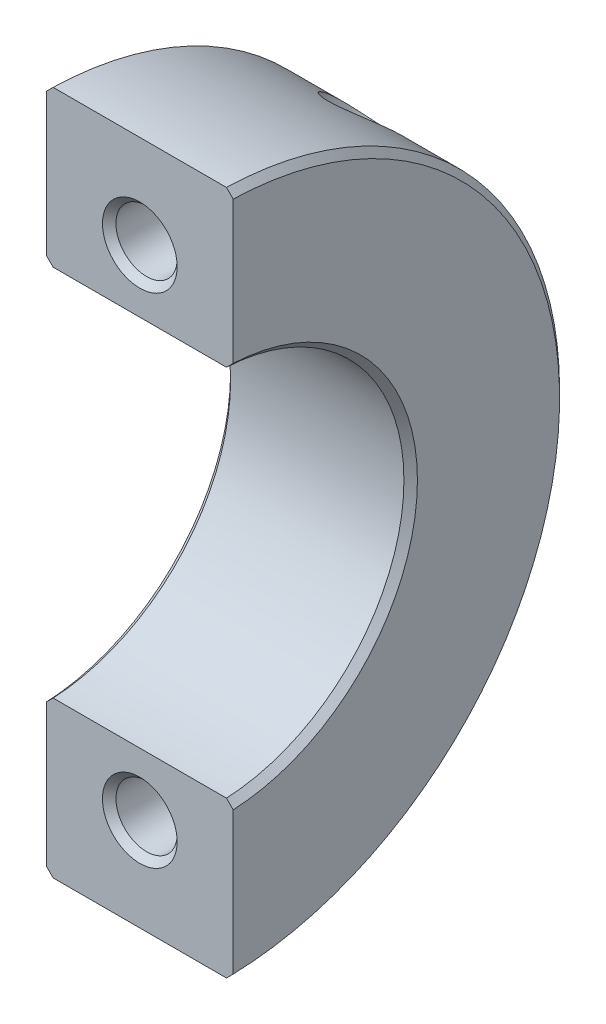
ISO-10303-21;
HEADER;
FILE_DESCRIPTION(('STEP AP214'),'2;1');
FILE_NAME('part.step','',(''),(''),'','','');
FILE_SCHEMA(('AUTOMOTIVE_DESIGN { 1 0 10303 214 1 1 1 1 }'));
ENDSEC;
DATA;
#1=APPLICATION_CONTEXT('core data for automotive mechanical design processes');
#2=APPLICATION_PROTOCOL_DEFINITION('international standard','automotive_design',2000,#1);
#3=PRODUCT_CONTEXT('',#1,'mechanical');
#4=PRODUCT('Part','Part','',(#3));
#5=PRODUCT_RELATED_PRODUCT_CATEGORY('part','',(#4));
#6=PRODUCT_DEFINITION_FORMATION('','',#4);
#7=PRODUCT_DEFINITION_CONTEXT('part definition',#1,'design');
#8=PRODUCT_DEFINITION('design','',#6,#7);
#9=PRODUCT_DEFINITION_SHAPE('','',#8);
#10=(LENGTH_UNIT() NAMED_UNIT(*) SI_UNIT(.MILLI.,.METRE.));
#11=(NAMED_UNIT(*) PLANE_ANGLE_UNIT() SI_UNIT($,.RADIAN.));
#12=(NAMED_UNIT(*) SI_UNIT($,.STERADIAN.) SOLID_ANGLE_UNIT());
#13=UNCERTAINTY_MEASURE_WITH_UNIT(LENGTH_MEASURE(1.E-05),#10,'distance_accuracy_value','');
#14=(GEOMETRIC_REPRESENTATION_CONTEXT(3) GLOBAL_UNCERTAINTY_ASSIGNED_CONTEXT((#13)) GLOBAL_UNIT_ASSIGNED_CONTEXT((#10,
#11,#12)) REPRESENTATION_CONTEXT('',''));
#15=CARTESIAN_POINT('',(0.,0.,0.));
#16=DIRECTION('',(0.,0.,1.));
#17=DIRECTION('',(1.,0.,0.));
#18=AXIS2_PLACEMENT_3D('',#15,#16,#17);
#19=CARTESIAN_POINT('',(-7.5,27.4897708247995,-0.75));
#20=DIRECTION('',(0.,0.,1.));
#21=DIRECTION('',(1.,0.,0.));
#22=AXIS2_PLACEMENT_3D('',#19,#20,#21);
#23=PLANE('',#22);
#24=CARTESIAN_POINT('',(0.,20.,-0.75));
#25=DIRECTION('',(0.,0.,1.));
#26=DIRECTION('',(1.,0.,0.));
#27=AXIS2_PLACEMENT_3D('',#24,#25,#26);
#28=CIRCLE('',#27,2.99999999993467);
#29=CARTESIAN_POINT('',(2.99999999993467,20.,-0.75));
#30=VERTEX_POINT('',#29);
#31=EDGE_CURVE('E280',#30,#30,#28,.F.);
#32=ORIENTED_EDGE('',*,*,#31,.T.);
#33=EDGE_LOOP('',(#32));
#34=FACE_BOUND('',#33,.T.);
#35=DIRECTION('',(-1.,0.,0.));
#36=VECTOR('',#35,1.);
#37=CARTESIAN_POINT('',(7.5,14.9812382665786,-0.75));
#38=LINE('',#37,#36);
#39=CARTESIAN_POINT('',(6.95850000006539,14.9812382665786,-0.75));
#40=VERTEX_POINT('',#39);
#41=CARTESIAN_POINT('',(-6.9585000000653,14.9812382665786,-0.75));
#42=VERTEX_POINT('',#41);
#43=EDGE_CURVE('E133',#40,#42,#38,.T.);
#44=ORIENTED_EDGE('',*,*,#43,.F.);
#45=CARTESIAN_POINT('',(6.95850000006539,14.9812382665786,-0.75));
#46=CARTESIAN_POINT('',(7.04874806257381,15.0715992810951,-0.75));
#47=CARTESIAN_POINT('',(7.13899709382266,15.1619593280405,-0.75));
#48=CARTESIAN_POINT('',(7.31949709380087,15.342677486789,-0.75));
#49=CARTESIAN_POINT('',(7.40974806253022,15.4330355985921,-0.75));
#50=CARTESIAN_POINT('',(7.5,15.5233927428242,-0.75));
#51=B_SPLINE_CURVE_WITH_KNOTS('',3,(#45,#46,#47,#48,#49,#50),.UNSPECIFIED.,.F.,.F.,(4,2,4),(0.,
0.383129784182915,0.766259568364265),.UNSPECIFIED.);
#52=CARTESIAN_POINT('',(7.5,15.5233927428242,-0.75));
#53=VERTEX_POINT('',#52);
#54=EDGE_CURVE('E234',#40,#53,#51,.T.);
#55=ORIENTED_EDGE('',*,*,#54,.T.);
#56=DIRECTION('',(0.,-1.,0.));
#57=VECTOR('',#56,1.);
#58=CARTESIAN_POINT('',(7.5,27.4897708247995,-0.75));
#59=LINE('',#58,#57);
#60=CARTESIAN_POINT('',(7.5,26.9480652784857,-0.75));
#61=VERTEX_POINT('',#60);
#62=EDGE_CURVE('E125',#61,#53,#59,.T.);
#63=ORIENTED_EDGE('',*,*,#62,.F.);
#64=CARTESIAN_POINT('',(7.5,26.9480652784857,-0.75));
#65=CARTESIAN_POINT('',(7.40975034084149,27.0383498769059,-0.75));
#66=CARTESIAN_POINT('',(7.31950051126768,27.1286343049755,-0.75));
#67=CARTESIAN_POINT('',(7.13900051128947,27.3092028204135,-0.75));
#68=CARTESIAN_POINT('',(7.04875034088507,27.3994869077818,-0.75));
#69=CARTESIAN_POINT('',(6.95850000006538,27.4897708247995,-0.75));
#70=B_SPLINE_CURVE_WITH_KNOTS('',3,(#64,#65,#66,#67,#68,#69),.UNSPECIFIED.,.F.,.F.,(4,2,4),(0.,
0.382971000481282,0.765942000962532),.UNSPECIFIED.);
#71=CARTESIAN_POINT('',(6.95850000006537,27.4897708247995,-0.75));
#72=VERTEX_POINT('',#71);
#73=EDGE_CURVE('E223',#61,#72,#70,.T.);
#74=ORIENTED_EDGE('',*,*,#73,.T.);
#75=DIRECTION('',(1.,0.,0.));
#76=VECTOR('',#75,1.);
#77=CARTESIAN_POINT('',(-7.5,27.4897708247995,-0.75));
#78=LINE('',#77,#76);
#79=CARTESIAN_POINT('',(-6.95850000006534,27.4897708247995,-0.75));
#80=VERTEX_POINT('',#79);
#81=EDGE_CURVE('E145',#80,#72,#78,.T.);
#82=ORIENTED_EDGE('',*,*,#81,.F.);
#83=CARTESIAN_POINT('',(-6.95850000006534,27.4897708247995,-0.75));
#84=CARTESIAN_POINT('',(-7.04875034088504,27.3994869077818,-0.75));
#85=CARTESIAN_POINT('',(-7.13900051128945,27.3092028204135,-0.75));
#86=CARTESIAN_POINT('',(-7.31950051126767,27.1286343049755,-0.75));
#87=CARTESIAN_POINT('',(-7.40975034084148,27.0383498769059,-0.75));
#88=CARTESIAN_POINT('',(-7.5,26.9480652784856,-0.75));
#89=B_SPLINE_CURVE_WITH_KNOTS('',3,(#83,#84,#85,#86,#87,#88),.UNSPECIFIED.,.F.,.F.,(4,2,4),(0.,
0.382971000481283,0.765942000962598),.UNSPECIFIED.);
#90=CARTESIAN_POINT('',(-7.5,26.9480652784856,-0.75));
#91=VERTEX_POINT('',#90);
#92=EDGE_CURVE('E60',#80,#91,#89,.T.);
#93=ORIENTED_EDGE('',*,*,#92,.T.);
#94=DIRECTION('',(0.,-1.,0.));
#95=VECTOR('',#94,1.);
#96=CARTESIAN_POINT('',(-7.5,27.4897708247995,-0.75));
#97=LINE('',#96,#95);
#98=CARTESIAN_POINT('',(-7.5,15.5233927428243,-0.75));
#99=VERTEX_POINT('',#98);
#100=EDGE_CURVE('E141',#91,#99,#97,.T.);
#101=ORIENTED_EDGE('',*,*,#100,.T.);
#102=CARTESIAN_POINT('',(-7.5,15.5233927428243,-0.75));
#103=CARTESIAN_POINT('',(-7.4097480625302,15.4330355985922,-0.75));
#104=CARTESIAN_POINT('',(-7.31949709380084,15.3426774867891,-0.75));
#105=CARTESIAN_POINT('',(-7.13899709382261,15.1619593280405,-0.75));
#106=CARTESIAN_POINT('',(-7.04874806257374,15.0715992810951,-0.75));
#107=CARTESIAN_POINT('',(-6.95850000006531,14.9812382665786,-0.75));
#108=B_SPLINE_CURVE_WITH_KNOTS('',3,(#102,#103,#104,#105,#106,#107),.UNSPECIFIED.,.F.,.F.,(4,2,
4),(0.,0.383129784181416,0.766259568364395),.UNSPECIFIED.);
#109=EDGE_CURVE('E229',#99,#42,#108,.T.);
#110=ORIENTED_EDGE('',*,*,#109,.T.);
#111=EDGE_LOOP('',(#44,#55,#63,#74,#82,#93,#101,#110));
#112=FACE_BOUND('',#111,.T.);
#113=ADVANCED_FACE('F37',(#34,#112),#23,.T.);
#114=CARTESIAN_POINT('',(-7.5,0.,0.));
#115=DIRECTION('',(1.,0.,0.));
#116=DIRECTION('',(0.,0.,-1.));
#117=AXIS2_PLACEMENT_3D('',#114,#115,#116);
#118=CYLINDRICAL_SURFACE('',#117,27.5);
#119=CARTESIAN_POINT('',(2.45850000000001,-20.,-18.8745860881769));
#120=CARTESIAN_POINT('',(2.45849990353132,-20.1028473085006,-18.7656070962104));
#121=CARTESIAN_POINT('',(2.45205660136979,-20.2047864967451,-18.6558007197101));
#122=CARTESIAN_POINT('',(2.42683352506415,-20.4062127973291,-18.4352593397697));
#123=CARTESIAN_POINT('',(2.40804748233893,-20.5056986370199,-18.3245238927044));
#124=CARTESIAN_POINT('',(2.35839998531785,-20.7017232367494,-18.1027788157753));
#125=CARTESIAN_POINT('',(2.32751594671807,-20.798256118783,-17.9917690612282));
#126=CARTESIAN_POINT('',(2.25372560210437,-20.9875531857472,-17.7705874156801));
#127=CARTESIAN_POINT('',(2.21082427894673,-21.0803189144783,-17.6604151968088));
#128=CARTESIAN_POINT('',(2.12572947491026,-21.2374253079542,-17.4709088219299));
#129=CARTESIAN_POINT('',(2.0863621513782,-21.3027832090554,-17.3911406618269));
#130=CARTESIAN_POINT('',(2.00074605912717,-21.430792375411,-17.2331502012469));
#131=CARTESIAN_POINT('',(1.95449878753136,-21.4934442257025,-17.1549275686374));
#132=CARTESIAN_POINT('',(1.85486628290582,-21.6155148899159,-17.00085735911));
#133=CARTESIAN_POINT('',(1.80149703964181,-21.6749405384192,-16.9250049184081));
#134=CARTESIAN_POINT('',(1.68707480818979,-21.7901360073354,-16.7764360133313));
#135=CARTESIAN_POINT('',(1.62602583383806,-21.8459077145018,-16.7037179372354));
#136=CARTESIAN_POINT('',(1.48222085932619,-21.9640786409367,-16.5481303560658));
#137=CARTESIAN_POINT('',(1.39757961859874,-22.0254970285639,-16.466230537263));
#138=CARTESIAN_POINT('',(1.21495130899149,-22.1400246914178,-16.3119129621685));
#139=CARTESIAN_POINT('',(1.11697958578317,-22.1931433721422,-16.2394844880513));
#140=CARTESIAN_POINT('',(0.932372676282858,-22.2765135458774,-16.1248474034656));
#141=CARTESIAN_POINT('',(0.848763808545262,-22.3091854879332,-16.0795716418497));
#142=CARTESIAN_POINT('',(0.673716040498875,-22.3661694961881,-16.0002141588967));
#143=CARTESIAN_POINT('',(0.582290132173302,-22.3904951091965,-15.9661143021744));
#144=CARTESIAN_POINT('',(0.409722770569238,-22.4254247493858,-15.9170059338798));
#145=CARTESIAN_POINT('',(0.32957889679,-22.4376844677686,-15.8997015893727));
#146=CARTESIAN_POINT('',(0.166859112927502,-22.4541902575735,-15.8763835032391));
#147=CARTESIAN_POINT('',(0.0842850752854429,-22.4584423427754,-15.870361288684));
#148=CARTESIAN_POINT('',(-0.0809858135138199,-22.4585565513222,-15.8701996759227));
#149=CARTESIAN_POINT('',(-0.163682688167048,-22.4544080813743,-15.8760752811402));
#150=CARTESIAN_POINT('',(-0.326667547666631,-22.4380806179644,-15.8991423977663));
#151=CARTESIAN_POINT('',(-0.406953684148092,-22.4258956192123,-15.916342371284));
#152=CARTESIAN_POINT('',(-0.582086480635042,-22.3906441964351,-15.9659065434751));
#153=CARTESIAN_POINT('',(-0.675788465351909,-22.3656650076208,-16.0009236635697));
#154=CARTESIAN_POINT('',(-0.854981333189616,-22.3069823126791,-16.0826325826107));
#155=CARTESIAN_POINT('',(-0.940456560202937,-22.2732626059613,-16.1293460552673));
#156=CARTESIAN_POINT('',(-1.14248897313866,-22.1809641066205,-16.2561849634975));
#157=CARTESIAN_POINT('',(-1.25387645836865,-22.1182815031823,-16.3414950232853));
#158=CARTESIAN_POINT('',(-1.4592758798392,-21.9824127796686,-16.523817452469));
#159=CARTESIAN_POINT('',(-1.55324474941753,-21.9092014001214,-16.6208578721118));
#160=CARTESIAN_POINT('',(-1.70793931433483,-21.7707630615361,-16.8016099282702));
#161=CARTESIAN_POINT('',(-1.77153532366999,-21.7069569816572,-16.883998678772));
#162=CARTESIAN_POINT('',(-1.88963359642018,-21.5752269176095,-17.05200811214));
#163=CARTESIAN_POINT('',(-1.94413061397557,-21.5073005885377,-17.1376306247345));
#164=CARTESIAN_POINT('',(-2.04459968043805,-21.3679245571619,-17.3111003929168));
#165=CARTESIAN_POINT('',(-2.09056417740289,-21.2964718038247,-17.3989495418409));
#166=CARTESIAN_POINT('',(-2.17427537068142,-21.150573890446,-17.5760173891968));
#167=CARTESIAN_POINT('',(-2.21202353614821,-21.0761292682019,-17.6652358397259));
#168=CARTESIAN_POINT('',(-2.28111226995138,-20.921027422208,-17.8486890274963));
#169=CARTESIAN_POINT('',(-2.31206650110297,-20.8402427981969,-17.9429618367341));
#170=CARTESIAN_POINT('',(-2.36526201567847,-20.6761631323197,-18.1317944152689));
#171=CARTESIAN_POINT('',(-2.38750038275921,-20.5928672602083,-18.2263542699647));
#172=CARTESIAN_POINT('',(-2.4409940766594,-20.339853442136,-18.509569676917));
#173=CARTESIAN_POINT('',(-2.45910807939005,-20.1668284061082,-18.6979754978234));
#174=CARTESIAN_POINT('',(-2.45788493716535,-19.8224731769478,-19.0625309532353));
#175=CARTESIAN_POINT('',(-2.4399796551361,-19.651339669668,-19.2388720934584));
#176=CARTESIAN_POINT('',(-2.36574048621276,-19.3084954004601,-19.5829162746263));
#177=CARTESIAN_POINT('',(-2.30945098475115,-19.1367855329637,-19.750629052306));
#178=CARTESIAN_POINT('',(-2.17480430551793,-18.8455678341072,-20.0280674266222));
#179=CARTESIAN_POINT('',(-2.10661594356735,-18.7245663064784,-20.141156284448));
#180=CARTESIAN_POINT('',(-1.94527157335692,-18.4899181763153,-20.3567713799904));
#181=CARTESIAN_POINT('',(-1.8521504182697,-18.3762615796474,-20.4593120879297));
#182=CARTESIAN_POINT('',(-1.66271698846492,-18.185182718517,-20.6291498931657));
#183=CARTESIAN_POINT('',(-1.57148126295003,-18.1052493075079,-20.69926650688));
#184=CARTESIAN_POINT('',(-1.37298128064481,-17.9568541170779,-20.8281304337483));
#185=CARTESIAN_POINT('',(-1.26573537361238,-17.8883793926218,-20.8868905882417));
#186=CARTESIAN_POINT('',(-1.05522949905044,-17.7768249411045,-20.9818728766762));
#187=CARTESIAN_POINT('',(-0.954157857955895,-17.7314262739956,-21.0202062571219));
#188=CARTESIAN_POINT('',(-0.743496282775712,-17.6539383731537,-21.0853274503553));
#189=CARTESIAN_POINT('',(-0.633910197018848,-17.6218431676452,-21.1121204437059));
#190=CARTESIAN_POINT('',(-0.40845736024515,-17.5729139553767,-21.1528659077745));
#191=CARTESIAN_POINT('',(-0.292562934914608,-17.5561540966719,-21.1667559964239));
#192=CARTESIAN_POINT('',(-0.0587449347170487,-17.5394120125801,-21.1806316380468));
#193=CARTESIAN_POINT('',(0.0591780458441868,-17.5394249542408,-21.1806211963502));
#194=CARTESIAN_POINT('',(0.283119756180512,-17.5554945745109,-21.1673023421418));
#195=CARTESIAN_POINT('',(0.389307092763932,-17.5702049394297,-21.1551098297485));
#196=CARTESIAN_POINT('',(0.597077822560281,-17.6127488910621,-21.1197025270019));
#197=CARTESIAN_POINT('',(0.698661206416872,-17.6405825044441,-21.0964877142498));
#198=CARTESIAN_POINT('',(0.897448835913888,-17.7086832472033,-21.0393570156364));
#199=CARTESIAN_POINT('',(0.994474832902504,-17.7492499380376,-21.0051828245404));
#200=CARTESIAN_POINT('',(1.1796587894884,-17.8405310184917,-20.9277098907923));
#201=CARTESIAN_POINT('',(1.26781249667164,-17.8912502396541,-20.8844068032167));
#202=CARTESIAN_POINT('',(1.46729077659321,-18.0224751878166,-20.7713863037255));
#203=CARTESIAN_POINT('',(1.57401103037066,-18.1068325364389,-20.6979920389709));
#204=CARTESIAN_POINT('',(1.76787530401491,-18.2864119944944,-20.5395121629318));
#205=CARTESIAN_POINT('',(1.85497873868291,-18.3816560250281,-20.4544028897375));
#206=CARTESIAN_POINT('',(2.03581028533496,-18.6116233473655,-20.2457094160712));
#207=CARTESIAN_POINT('',(2.12220934568822,-18.7489890804573,-20.118707217693));
#208=CARTESIAN_POINT('',(2.26408210099224,-19.0289991277318,-19.8540786133856));
#209=CARTESIAN_POINT('',(2.31953875947846,-19.1716463038087,-19.7164464020947));
#210=CARTESIAN_POINT('',(2.39433859251578,-19.4293790645306,-19.46214963426));
#211=CARTESIAN_POINT('',(2.41866330015347,-19.5443188699962,-19.346741539999));
#212=CARTESIAN_POINT('',(2.45074253979342,-19.7732034594356,-19.112749328735));
#213=CARTESIAN_POINT('',(2.45850010585251,-19.8871484217946,-18.9941657973006));
#214=CARTESIAN_POINT('',(2.45850000000001,-20.,-18.8745860881769));
#215=B_SPLINE_CURVE_WITH_KNOTS('',3,(#119,#120,#121,#122,#123,#124,#125,#126,#127,#128,#129,
#130,#131,#132,#133,#134,#135,#136,#137,#138,#139,#140,#141,#142,#143,#144,#145,#146,#147,#148,
#149,#150,#151,#152,#153,#154,#155,#156,#157,#158,#159,#160,#161,#162,#163,#164,#165,#166,#167,
#168,#169,#170,#171,#172,#173,#174,#175,#176,#177,#178,#179,#180,#181,#182,#183,#184,#185,#186,
#187,#188,#189,#190,#191,#192,#193,#194,#195,#196,#197,#198,#199,#200,#201,#202,#203,#204,#205,
#206,#207,#208,#209,#210,#211,#212,#213,#214),.UNSPECIFIED.,.T.,.F.,(4,2,2,2,2,2,2,2,2,2,2,2,2,
2,2,2,2,2,2,2,2,2,2,2,2,2,2,2,2,2,2,2,2,2,2,2,2,2,2,2,2,2,2,2,2,2,2,4),(0.,0.44937381048829,
0.898976023731246,1.34942157638547,1.79968063171323,2.13060080225893,2.4614490673901,
2.79156665376201,3.12151241443172,3.51900890832684,3.91605162711458,4.21665714253409,
4.51677241535759,4.76440290494857,5.01184734829931,5.25960401908409,5.50754603593245,
5.81514603786734,6.12332030618504,6.58177925391551,7.04135702482384,7.40711930179255,
7.77309172964731,8.13938654297499,8.50561580563099,8.88912380650695,9.27276002049176,
10.0391648040731,10.7757049043222,11.5113947505346,12.0469506342239,12.5817617461589,
13.0005299570238,13.4188218383139,13.7690860364923,14.1191928342625,14.4709836261996,
14.822673052376,15.1448523809391,15.4670323642186,15.7974456546367,16.1280165626657,
16.5891816767045,17.0512923042876,17.6661683782601,18.2813826613844,18.7745587522247,
19.2676445165208),.UNSPECIFIED.);
#216=CARTESIAN_POINT('',(2.45850000000001,-20.,-18.8745860881769));
#217=VERTEX_POINT('',#216);
#218=EDGE_CURVE('E156',#217,#217,#215,.T.);
#219=ORIENTED_EDGE('',*,*,#218,.F.);
#220=EDGE_LOOP('',(#219));
#221=FACE_BOUND('',#220,.T.);
#222=CARTESIAN_POINT('',(2.45850000000001,20.,-18.8745860881769));
#223=CARTESIAN_POINT('',(2.45849903685019,19.9101006922754,-18.9698448801011));
#224=CARTESIAN_POINT('',(2.45357126295832,19.8195082789246,-19.0644708455221));
#225=CARTESIAN_POINT('',(2.43336040850576,19.6375480339031,-19.2518534458948));
#226=CARTESIAN_POINT('',(2.41807303516138,19.5461798962945,-19.3446092894961));
#227=CARTESIAN_POINT('',(2.35568822660431,19.2719385893018,-19.6190885219108));
#228=CARTESIAN_POINT('',(2.29207160189933,19.0886792727254,-19.7972874102591));
#229=CARTESIAN_POINT('',(2.14497419387902,18.7913925792562,-20.0788558074421));
#230=CARTESIAN_POINT('',(2.07553498470458,18.6749530704127,-20.1871160623274));
#231=CARTESIAN_POINT('',(1.91302740268866,18.449588831665,-20.39327808539));
#232=CARTESIAN_POINT('',(1.81999872034657,18.3406518660264,-20.4911968654528));
#233=CARTESIAN_POINT('',(1.63026638611544,18.1560046822503,-20.6548207043497));
#234=CARTESIAN_POINT('',(1.53799229821059,18.0779999029401,-20.7230562415749));
#235=CARTESIAN_POINT('',(1.33778868436917,17.9336705168636,-20.8480827088889));
#236=CARTESIAN_POINT('',(1.22987540426258,17.8673339456743,-20.904885370822));
#237=CARTESIAN_POINT('',(1.01844336840866,17.7597515283284,-20.9963189155455));
#238=CARTESIAN_POINT('',(0.917018836872623,17.7161850316685,-21.0330476497061));
#239=CARTESIAN_POINT('',(0.706058838015553,17.6424242410448,-21.0949566978063));
#240=CARTESIAN_POINT('',(0.596527211687081,17.6122236612946,-21.1201424404368));
#241=CARTESIAN_POINT('',(0.371672106583352,17.5670420292585,-21.1577390779018));
#242=CARTESIAN_POINT('',(0.256324765164128,17.5521301322511,-21.1700919290419));
#243=CARTESIAN_POINT('',(0.0240332834442365,17.5388691170811,-21.1810800934512));
#244=CARTESIAN_POINT('',(-0.0929104746634521,17.5405161017214,-21.1797186344365));
#245=CARTESIAN_POINT('',(-0.3153140157591,17.5594511076944,-21.164021238903));
#246=CARTESIAN_POINT('',(-0.420956313747384,17.5755050118056,-21.1507089923366));
#247=CARTESIAN_POINT('',(-0.627397170821221,17.6205545252133,-21.1131927809313));
#248=CARTESIAN_POINT('',(-0.728195660038349,17.6495503211252,-21.0889886590371));
#249=CARTESIAN_POINT('',(-0.9258564614326,17.720005665564,-21.0298255476063));
#250=CARTESIAN_POINT('',(-1.0224904279818,17.7618335143142,-20.9945479233707));
#251=CARTESIAN_POINT('',(-1.20669657001686,17.8555172469202,-20.9149298204712));
#252=CARTESIAN_POINT('',(-1.29426392622965,17.9073784223144,-20.8705845588641));
#253=CARTESIAN_POINT('',(-1.49295560133528,18.0417063875032,-20.754697963718));
#254=CARTESIAN_POINT('',(-1.59927771468659,18.1280668405694,-20.6794121901448));
#255=CARTESIAN_POINT('',(-1.79190492255418,18.3114880199797,-20.5171755555197));
#256=CARTESIAN_POINT('',(-1.87817166689438,18.4085687315669,-20.4302028393513));
#257=CARTESIAN_POINT('',(-2.05683343965443,18.6428075102148,-20.217028986525));
#258=CARTESIAN_POINT('',(-2.14172713979814,18.7825576277662,-20.0874003785006));
#259=CARTESIAN_POINT('',(-2.28012256490158,19.0670623185141,-19.8175651109282));
#260=CARTESIAN_POINT('',(-2.33358161619821,19.2118234134819,-19.6773443620498));
#261=CARTESIAN_POINT('',(-2.42499414915662,19.5491341392264,-19.3430652754481));
#262=CARTESIAN_POINT('',(-2.45228128719907,19.7419426797389,-19.1463060189451));
#263=CARTESIAN_POINT('',(-2.46019238311569,20.0268087792558,-18.8466507371827));
#264=CARTESIAN_POINT('',(-2.45730264309876,20.1211508884062,-18.7458885968417));
#265=CARTESIAN_POINT('',(-2.44094150561412,20.3079100171413,-18.5433998693379));
#266=CARTESIAN_POINT('',(-2.42747130927252,20.4003272540212,-18.4416733929444));
#267=CARTESIAN_POINT('',(-2.38994802721896,20.5842348525337,-18.236190163968));
#268=CARTESIAN_POINT('',(-2.36572011367417,20.6756832249602,-18.132428129409));
#269=CARTESIAN_POINT('',(-2.30676837576768,20.8555712661266,-17.925232643225));
#270=CARTESIAN_POINT('',(-2.27204252397635,20.9440103500195,-17.8217992589739));
#271=CARTESIAN_POINT('',(-2.19205793360889,21.1172261999382,-17.6162083026713));
#272=CARTESIAN_POINT('',(-2.14681480393341,21.2020081746224,-17.5140490740717));
#273=CARTESIAN_POINT('',(-2.04543582414508,21.367412709244,-17.3118666442096));
#274=CARTESIAN_POINT('',(-1.98930550828066,21.4480373562149,-17.2118423862395));
#275=CARTESIAN_POINT('',(-1.85217559743637,21.6212264447277,-16.993993796764));
#276=CARTESIAN_POINT('',(-1.76842395791497,21.7126379262761,-16.8769584644444));
#277=CARTESIAN_POINT('',(-1.58200387079291,21.886184432419,-16.6512787271705));
#278=CARTESIAN_POINT('',(-1.47935899552608,21.9683308129793,-16.5426241030469));
#279=CARTESIAN_POINT('',(-1.28409658604738,22.0988111660279,-16.367681096218));
#280=CARTESIAN_POINT('',(-1.19659753415387,22.1502031066418,-16.2980019337074));
#281=CARTESIAN_POINT('',(-1.00952552026795,22.2441011838583,-16.1696087992673));
#282=CARTESIAN_POINT('',(-0.909974149222804,22.2866228493724,-16.1108756839895));
#283=CARTESIAN_POINT('',(-0.726674269209424,22.3500931760249,-16.0226555804632));
#284=CARTESIAN_POINT('',(-0.645641435112436,22.373774654966,-15.9895387469609));
#285=CARTESIAN_POINT('',(-0.478024463816118,22.4131099264462,-15.9343546477579));
#286=CARTESIAN_POINT('',(-0.391446487313022,22.4287724598263,-15.9122753515018));
#287=CARTESIAN_POINT('',(-0.214014392892578,22.4508080941093,-15.8811712946052));
#288=CARTESIAN_POINT('',(-0.123131477610433,22.4571054501036,-15.8722529835068));
#289=CARTESIAN_POINT('',(0.05903306417025,22.4594767364578,-15.8688976679084));
#290=CARTESIAN_POINT('',(0.150314589272235,22.4555531309576,-15.8744571729964));
#291=CARTESIAN_POINT('',(0.319634710134792,22.4389475487239,-15.8979178937897));
#292=CARTESIAN_POINT('',(0.397994576361037,22.4273177234483,-15.9143360881391));
#293=CARTESIAN_POINT('',(0.550747521023589,22.3972835493224,-15.9565773084908));
#294=CARTESIAN_POINT('',(0.625138608555461,22.3788758363141,-15.9824050047673));
#295=CARTESIAN_POINT('',(0.802951670482139,22.3263022366073,-16.0558117444263));
#296=CARTESIAN_POINT('',(0.903512449780082,22.2887990684613,-16.107904023302));
#297=CARTESIAN_POINT('',(1.09328982636146,22.2044925915613,-16.2239223597509));
#298=CARTESIAN_POINT('',(1.18247705860706,22.1576659776896,-16.287878043433));
#299=CARTESIAN_POINT('',(1.33172902541958,22.0679833741131,-16.4090983881217));
#300=CARTESIAN_POINT('',(1.39391228149913,22.0264730323304,-16.4648004868407));
#301=CARTESIAN_POINT('',(1.51205257313224,21.9399179296566,-16.5799640879008));
#302=CARTESIAN_POINT('',(1.56800606806902,21.8948711834349,-16.6394276982563));
#303=CARTESIAN_POINT('',(1.72734990459582,21.7551390711834,-16.8222275929634));
#304=CARTESIAN_POINT('',(1.82203071341495,21.6559829546375,-16.9498081224198));
#305=CARTESIAN_POINT('',(1.96976643781293,21.474555282198,-17.1787470688035));
#306=CARTESIAN_POINT('',(2.02732675889413,21.394161461276,-17.2788001560385));
#307=CARTESIAN_POINT('',(2.13144912516408,21.2290945597011,-17.4812062613827));
#308=CARTESIAN_POINT('',(2.178005032109,21.144419122584,-17.5835605283935));
#309=CARTESIAN_POINT('',(2.26039039979968,20.9715995482572,-17.7893241617886));
#310=CARTESIAN_POINT('',(2.29623599186093,20.8834608561155,-17.8927316963697));
#311=CARTESIAN_POINT('',(2.35740886436471,20.7041406544402,-18.0999258966482));
#312=CARTESIAN_POINT('',(2.38274135737464,20.6129606771126,-18.2037123486591));
#313=CARTESIAN_POINT('',(2.42114549969704,20.4356678485165,-18.4024377861389));
#314=CARTESIAN_POINT('',(2.43505841143516,20.349760231391,-18.4973980671296));
#315=CARTESIAN_POINT('',(2.45373827295782,20.1761256796397,-18.6866384423076));
#316=CARTESIAN_POINT('',(2.45850094706442,20.0883979138472,-18.7809181980136));
#317=CARTESIAN_POINT('',(2.45850000000001,20.,-18.8745860881769));
#318=B_SPLINE_CURVE_WITH_KNOTS('',3,(#222,#223,#224,#225,#226,#227,#228,#229,#230,#231,#232,
#233,#234,#235,#236,#237,#238,#239,#240,#241,#242,#243,#244,#245,#246,#247,#248,#249,#250,#251,
#252,#253,#254,#255,#256,#257,#258,#259,#260,#261,#262,#263,#264,#265,#266,#267,#268,#269,#270,
#271,#272,#273,#274,#275,#276,#277,#278,#279,#280,#281,#282,#283,#284,#285,#286,#287,#288,#289,
#290,#291,#292,#293,#294,#295,#296,#297,#298,#299,#300,#301,#302,#303,#304,#305,#306,#307,#308,
#309,#310,#311,#312,#313,#314,#315,#316,#317),.UNSPECIFIED.,.T.,.F.,(4,2,2,2,2,2,2,2,2,2,2,2,2,
2,2,2,2,2,2,2,2,2,2,2,2,2,2,2,2,2,2,2,2,2,2,2,2,2,2,2,2,2,2,2,2,2,2,4),(0.,0.392832093361082,
0.785827067074398,1.57074035825475,2.0896086863046,2.60760971843618,3.02234775735554,
3.43665801841441,3.78420263033112,4.13158362320045,4.4805290827694,4.82939241859149,
5.15095453211373,5.47252128254461,5.80435246371005,6.13635913082792,6.60268499012506,
7.06989536178153,7.69246827168433,8.31588440699508,9.14166780428412,9.55555948671656,
9.96940418967564,10.3902356855845,10.8111485071665,11.2314405875235,11.651519579432,
12.1617886586171,12.6714253585997,13.039672920399,13.40727028982,13.6783308735152,
13.9490953623079,14.2220380865259,14.4949150139192,14.7366074861892,14.9784200829231,
15.3343131982887,15.6911073410875,15.9704279726715,16.2499065513538,16.8096977045198,
17.2312412693948,17.6530194185883,18.0741590677353,18.4950896587286,18.8811807595787,
19.2674522273382),.UNSPECIFIED.);
#319=CARTESIAN_POINT('',(2.45850000000001,20.,-18.8745860881769));
#320=VERTEX_POINT('',#319);
#321=EDGE_CURVE('E148',#320,#320,#318,.T.);
#322=ORIENTED_EDGE('',*,*,#321,.F.);
#323=EDGE_LOOP('',(#322));
#324=FACE_BOUND('',#323,.T.);
#325=ORIENTED_EDGE('',*,*,#81,.T.);
#326=CARTESIAN_POINT('',(6.95850000006538,0.,0.));
#327=DIRECTION('',(1.,0.,0.));
#328=DIRECTION('',(0.,0.,-1.));
#329=AXIS2_PLACEMENT_3D('',#326,#327,#328);
#330=CIRCLE('',#329,27.5);
#331=CARTESIAN_POINT('',(6.95850000006537,-27.4897708247995,-0.75));
#332=VERTEX_POINT('',#331);
#333=EDGE_CURVE('E46',#72,#332,#330,.F.);
#334=ORIENTED_EDGE('',*,*,#333,.T.);
#335=DIRECTION('',(1.,0.,0.));
#336=VECTOR('',#335,1.);
#337=CARTESIAN_POINT('',(-7.5,-27.4897708247995,-0.75));
#338=LINE('',#337,#336);
#339=CARTESIAN_POINT('',(-6.95850000006534,-27.4897708247995,-0.75));
#340=VERTEX_POINT('',#339);
#341=EDGE_CURVE('E143',#340,#332,#338,.T.);
#342=ORIENTED_EDGE('',*,*,#341,.F.);
#343=CARTESIAN_POINT('',(-6.95850000006534,0.,0.));
#344=DIRECTION('',(1.,0.,0.));
#345=DIRECTION('',(0.,0.,-1.));
#346=AXIS2_PLACEMENT_3D('',#343,#344,#345);
#347=CIRCLE('',#346,27.5);
#348=EDGE_CURVE('E293',#340,#80,#347,.T.);
#349=ORIENTED_EDGE('',*,*,#348,.T.);
#350=EDGE_LOOP('',(#325,#334,#342,#349));
#351=FACE_BOUND('',#350,.T.);
#352=ADVANCED_FACE('F162',(#221,#324,#351),#118,.T.);
#353=CARTESIAN_POINT('',(0.,-20.,-0.75));
#354=DIRECTION('',(0.,0.,1.));
#355=DIRECTION('',(1.,0.,0.));
#356=AXIS2_PLACEMENT_3D('',#353,#354,#355);
#357=CIRCLE('',#356,2.99999999993467);
#358=CARTESIAN_POINT('',(2.99999999993467,-20.,-0.75));
#359=VERTEX_POINT('',#358);
#360=EDGE_CURVE('E115',#359,#359,#357,.F.);
#361=ORIENTED_EDGE('',*,*,#360,.T.);
#362=EDGE_LOOP('',(#361));
#363=FACE_BOUND('',#362,.T.);
#364=CARTESIAN_POINT('',(7.5,-15.5233927428242,-0.75));
#365=VERTEX_POINT('',#364);
#366=CARTESIAN_POINT('',(7.5,-26.9480652784857,-0.75));
#367=VERTEX_POINT('',#366);
#368=EDGE_CURVE('E122',#365,#367,#59,.T.);
#369=ORIENTED_EDGE('',*,*,#368,.F.);
#370=CARTESIAN_POINT('',(7.5,-15.5233927428242,-0.75));
#371=CARTESIAN_POINT('',(7.40974806253022,-15.4330355985921,-0.75));
#372=CARTESIAN_POINT('',(7.31949709380087,-15.342677486789,-0.75));
#373=CARTESIAN_POINT('',(7.13899709382266,-15.1619593280405,-0.75));
#374=CARTESIAN_POINT('',(7.04874806257381,-15.0715992810951,-0.75));
#375=CARTESIAN_POINT('',(6.95850000006539,-14.9812382665786,-0.75));
#376=B_SPLINE_CURVE_WITH_KNOTS('',3,(#370,#371,#372,#373,#374,#375),.UNSPECIFIED.,.F.,.F.,(4,2,
4),(0.,0.383129784181351,0.766259568364265),.UNSPECIFIED.);
#377=CARTESIAN_POINT('',(6.95850000006539,-14.9812382665786,-0.75));
#378=VERTEX_POINT('',#377);
#379=EDGE_CURVE('E104',#365,#378,#376,.T.);
#380=ORIENTED_EDGE('',*,*,#379,.T.);
#381=DIRECTION('',(-1.,0.,0.));
#382=VECTOR('',#381,1.);
#383=CARTESIAN_POINT('',(7.5,-14.9812382665786,-0.75));
#384=LINE('',#383,#382);
#385=CARTESIAN_POINT('',(-6.9585000000653,-14.9812382665786,-0.75));
#386=VERTEX_POINT('',#385);
#387=EDGE_CURVE('E137',#378,#386,#384,.T.);
#388=ORIENTED_EDGE('',*,*,#387,.T.);
#389=CARTESIAN_POINT('',(-6.95850000006531,-14.9812382665786,-0.75));
#390=CARTESIAN_POINT('',(-7.04874806257374,-15.0715992810951,-0.75));
#391=CARTESIAN_POINT('',(-7.13899709382261,-15.1619593280405,-0.75));
#392=CARTESIAN_POINT('',(-7.31949709380084,-15.3426774867891,-0.75));
#393=CARTESIAN_POINT('',(-7.4097480625302,-15.4330355985922,-0.75));
#394=CARTESIAN_POINT('',(-7.5,-15.5233927428243,-0.75));
#395=B_SPLINE_CURVE_WITH_KNOTS('',3,(#389,#390,#391,#392,#393,#394),.UNSPECIFIED.,.F.,.F.,(4,2,
4),(0.,0.383129784182978,0.766259568364395),.UNSPECIFIED.);
#396=CARTESIAN_POINT('',(-7.5,-15.5233927428243,-0.75));
#397=VERTEX_POINT('',#396);
#398=EDGE_CURVE('E202',#386,#397,#395,.T.);
#399=ORIENTED_EDGE('',*,*,#398,.T.);
#400=CARTESIAN_POINT('',(-7.5,-26.9480652784856,-0.75));
#401=VERTEX_POINT('',#400);
#402=EDGE_CURVE('E135',#397,#401,#97,.T.);
#403=ORIENTED_EDGE('',*,*,#402,.T.);
#404=CARTESIAN_POINT('',(-7.5,-26.9480652784856,-0.75));
#405=CARTESIAN_POINT('',(-7.40975034084148,-27.0383498769059,-0.75));
#406=CARTESIAN_POINT('',(-7.31950051126767,-27.1286343049755,-0.75));
#407=CARTESIAN_POINT('',(-7.13900051128945,-27.3092028204135,-0.75));
#408=CARTESIAN_POINT('',(-7.04875034088504,-27.3994869077818,-0.75));
#409=CARTESIAN_POINT('',(-6.95850000006534,-27.4897708247995,-0.75));
#410=B_SPLINE_CURVE_WITH_KNOTS('',3,(#404,#405,#406,#407,#408,#409),.UNSPECIFIED.,.F.,.F.,(4,2,
4),(0.,0.382971000481311,0.765942000962595),.UNSPECIFIED.);
#411=EDGE_CURVE('E126',#401,#340,#410,.T.);
#412=ORIENTED_EDGE('',*,*,#411,.T.);
#413=ORIENTED_EDGE('',*,*,#341,.T.);
#414=CARTESIAN_POINT('',(6.95850000006538,-27.4897708247995,-0.75));
#415=CARTESIAN_POINT('',(7.04875034088507,-27.3994869077818,-0.75));
#416=CARTESIAN_POINT('',(7.13900051128947,-27.3092028204135,-0.75));
#417=CARTESIAN_POINT('',(7.31950051126768,-27.1286343049755,-0.75));
#418=CARTESIAN_POINT('',(7.40975034084149,-27.0383498769059,-0.75));
#419=CARTESIAN_POINT('',(7.5,-26.9480652784857,-0.75));
#420=B_SPLINE_CURVE_WITH_KNOTS('',3,(#414,#415,#416,#417,#418,#419),.UNSPECIFIED.,.F.,.F.,(4,2,
4),(0.,0.382971000481252,0.765942000962531),.UNSPECIFIED.);
#421=EDGE_CURVE('E132',#332,#367,#420,.T.);
#422=ORIENTED_EDGE('',*,*,#421,.T.);
#423=EDGE_LOOP('',(#369,#380,#388,#399,#403,#412,#413,#422));
#424=FACE_BOUND('',#423,.T.);
#425=ADVANCED_FACE('F129',(#363,#424),#23,.T.);
#426=CARTESIAN_POINT('',(-7.5,0.,0.));
#427=DIRECTION('',(1.,0.,0.));
#428=DIRECTION('',(0.,0.,-1.));
#429=AXIS2_PLACEMENT_3D('',#426,#427,#428);
#430=PLANE('',#429);
#431=ORIENTED_EDGE('',*,*,#402,.F.);
#432=CARTESIAN_POINT('',(-7.5,0.,0.));
#433=DIRECTION('',(1.,0.,0.));
#434=DIRECTION('',(0.,0.,-1.));
#435=AXIS2_PLACEMENT_3D('',#432,#433,#434);
#436=CIRCLE('',#435,15.5414999999347);
#437=EDGE_CURVE('E53',#397,#99,#436,.T.);
#438=ORIENTED_EDGE('',*,*,#437,.T.);
#439=ORIENTED_EDGE('',*,*,#100,.F.);
#440=CARTESIAN_POINT('',(-7.5,0.,0.));
#441=DIRECTION('',(1.,0.,0.));
#442=DIRECTION('',(0.,0.,-1.));
#443=AXIS2_PLACEMENT_3D('',#440,#441,#442);
#444=CIRCLE('',#443,26.9585000000653);
#445=EDGE_CURVE('E287',#91,#401,#444,.F.);
#446=ORIENTED_EDGE('',*,*,#445,.T.);
#447=EDGE_LOOP('',(#431,#438,#439,#446));
#448=FACE_BOUND('',#447,.T.);
#449=ADVANCED_FACE('F177',(#448),#430,.F.);
#450=CARTESIAN_POINT('',(7.5,0.,0.));
#451=DIRECTION('',(1.,0.,0.));
#452=DIRECTION('',(0.,0.,-1.));
#453=AXIS2_PLACEMENT_3D('',#450,#451,#452);
#454=PLANE('',#453);
#455=ORIENTED_EDGE('',*,*,#62,.T.);
#456=CARTESIAN_POINT('',(7.5,0.,0.));
#457=DIRECTION('',(1.,0.,0.));
#458=DIRECTION('',(0.,0.,-1.));
#459=AXIS2_PLACEMENT_3D('',#456,#457,#458);
#460=CIRCLE('',#459,15.5414999999346);
#461=EDGE_CURVE('E108',#53,#365,#460,.F.);
#462=ORIENTED_EDGE('',*,*,#461,.T.);
#463=ORIENTED_EDGE('',*,*,#368,.T.);
#464=CARTESIAN_POINT('',(7.5,0.,0.));
#465=DIRECTION('',(1.,0.,0.));
#466=DIRECTION('',(0.,0.,-1.));
#467=AXIS2_PLACEMENT_3D('',#464,#465,#466);
#468=CIRCLE('',#467,26.9585000000654);
#469=EDGE_CURVE('E127',#367,#61,#468,.T.);
#470=ORIENTED_EDGE('',*,*,#469,.T.);
#471=EDGE_LOOP('',(#455,#462,#463,#470));
#472=FACE_BOUND('',#471,.T.);
#473=ADVANCED_FACE('F120',(#472),#454,.T.);
#474=CARTESIAN_POINT('',(7.5,0.,0.));
#475=DIRECTION('',(-1.,0.,0.));
#476=DIRECTION('',(0.,0.,1.));
#477=AXIS2_PLACEMENT_3D('',#474,#475,#476);
#478=CYLINDRICAL_SURFACE('',#477,15.);
#479=ORIENTED_EDGE('',*,*,#387,.F.);
#480=CARTESIAN_POINT('',(6.95850000006539,0.,0.));
#481=DIRECTION('',(1.,0.,0.));
#482=DIRECTION('',(0.,0.,-1.));
#483=AXIS2_PLACEMENT_3D('',#480,#481,#482);
#484=CIRCLE('',#483,15.);
#485=EDGE_CURVE('E109',#378,#40,#484,.T.);
#486=ORIENTED_EDGE('',*,*,#485,.T.);
#487=ORIENTED_EDGE('',*,*,#43,.T.);
#488=CARTESIAN_POINT('',(-6.95850000006531,0.,0.));
#489=DIRECTION('',(1.,0.,0.));
#490=DIRECTION('',(0.,0.,-1.));
#491=AXIS2_PLACEMENT_3D('',#488,#489,#490);
#492=CIRCLE('',#491,15.);
#493=EDGE_CURVE('E114',#42,#386,#492,.F.);
#494=ORIENTED_EDGE('',*,*,#493,.T.);
#495=EDGE_LOOP('',(#479,#486,#487,#494));
#496=FACE_BOUND('',#495,.T.);
#497=ADVANCED_FACE('F171',(#496),#478,.F.);
#498=CARTESIAN_POINT('',(0.,20.,-0.75));
#499=DIRECTION('',(0.,0.,1.));
#500=DIRECTION('',(1.,0.,0.));
#501=AXIS2_PLACEMENT_3D('',#498,#499,#500);
#502=CYLINDRICAL_SURFACE('',#501,2.45850000000001);
#503=CARTESIAN_POINT('',(0.,20.,-1.29149999993466));
#504=DIRECTION('',(0.,0.,1.));
#505=DIRECTION('',(1.,0.,0.));
#506=AXIS2_PLACEMENT_3D('',#503,#504,#505);
#507=CIRCLE('',#506,2.45850000000001);
#508=CARTESIAN_POINT('',(2.45850000000001,20.,-1.29149999993466));
#509=VERTEX_POINT('',#508);
#510=EDGE_CURVE('E11',#509,#509,#507,.T.);
#511=ORIENTED_EDGE('',*,*,#510,.T.);
#512=EDGE_LOOP('',(#511));
#513=FACE_BOUND('',#512,.T.);
#514=ORIENTED_EDGE('',*,*,#321,.T.);
#515=EDGE_LOOP('',(#514));
#516=FACE_BOUND('',#515,.T.);
#517=ADVANCED_FACE('F166',(#513,#516),#502,.F.);
#518=CARTESIAN_POINT('',(0.,-20.,-0.75));
#519=DIRECTION('',(0.,0.,1.));
#520=DIRECTION('',(1.,0.,0.));
#521=AXIS2_PLACEMENT_3D('',#518,#519,#520);
#522=CYLINDRICAL_SURFACE('',#521,2.45850000000001);
#523=CARTESIAN_POINT('',(0.,-20.,-1.29149999993466));
#524=DIRECTION('',(0.,0.,1.));
#525=DIRECTION('',(1.,0.,0.));
#526=AXIS2_PLACEMENT_3D('',#523,#524,#525);
#527=CIRCLE('',#526,2.45850000000001);
#528=CARTESIAN_POINT('',(2.45850000000001,-20.,-1.29149999993466));
#529=VERTEX_POINT('',#528);
#530=EDGE_CURVE('E285',#529,#529,#527,.T.);
#531=ORIENTED_EDGE('',*,*,#530,.T.);
#532=EDGE_LOOP('',(#531));
#533=FACE_BOUND('',#532,.T.);
#534=ORIENTED_EDGE('',*,*,#218,.T.);
#535=EDGE_LOOP('',(#534));
#536=FACE_BOUND('',#535,.T.);
#537=ADVANCED_FACE('F170',(#533,#536),#522,.F.);
#538=CARTESIAN_POINT('',(7.5,0.,0.));
#539=DIRECTION('',(1.,0.,0.));
#540=DIRECTION('',(0.,0.,-1.));
#541=AXIS2_PLACEMENT_3D('',#538,#539,#540);
#542=CONICAL_SURFACE('',#541,15.5414999999346,0.785398163397451);
#543=ORIENTED_EDGE('',*,*,#54,.F.);
#544=ORIENTED_EDGE('',*,*,#485,.F.);
#545=ORIENTED_EDGE('',*,*,#379,.F.);
#546=ORIENTED_EDGE('',*,*,#461,.F.);
#547=EDGE_LOOP('',(#543,#544,#545,#546));
#548=FACE_BOUND('',#547,.T.);
#549=ADVANCED_FACE('F107',(#548),#542,.F.);
#550=CARTESIAN_POINT('',(0.,-20.,-1.29149999993466));
#551=DIRECTION('',(0.,0.,1.));
#552=DIRECTION('',(1.,0.,0.));
#553=AXIS2_PLACEMENT_3D('',#550,#551,#552);
#554=CONICAL_SURFACE('',#553,2.45850000000001,0.785398163397452);
#555=ORIENTED_EDGE('',*,*,#360,.F.);
#556=EDGE_LOOP('',(#555));
#557=FACE_BOUND('',#556,.T.);
#558=ORIENTED_EDGE('',*,*,#530,.F.);
#559=EDGE_LOOP('',(#558));
#560=FACE_BOUND('',#559,.T.);
#561=ADVANCED_FACE('F250',(#557,#560),#554,.F.);
#562=CARTESIAN_POINT('',(-6.95850000006531,0.,0.));
#563=DIRECTION('',(-1.,0.,0.));
#564=DIRECTION('',(0.,0.,1.));
#565=AXIS2_PLACEMENT_3D('',#562,#563,#564);
#566=CONICAL_SURFACE('',#565,15.,0.785398163397458);
#567=ORIENTED_EDGE('',*,*,#109,.F.);
#568=ORIENTED_EDGE('',*,*,#437,.F.);
#569=ORIENTED_EDGE('',*,*,#398,.F.);
#570=ORIENTED_EDGE('',*,*,#493,.F.);
#571=EDGE_LOOP('',(#567,#568,#569,#570));
#572=FACE_BOUND('',#571,.T.);
#573=ADVANCED_FACE('F241',(#572),#566,.F.);
#574=CARTESIAN_POINT('',(7.5,0.,0.));
#575=DIRECTION('',(-1.,0.,0.));
#576=DIRECTION('',(0.,0.,1.));
#577=AXIS2_PLACEMENT_3D('',#574,#575,#576);
#578=CONICAL_SURFACE('',#577,26.9585000000654,0.785398163397442);
#579=ORIENTED_EDGE('',*,*,#421,.F.);
#580=ORIENTED_EDGE('',*,*,#333,.F.);
#581=ORIENTED_EDGE('',*,*,#73,.F.);
#582=ORIENTED_EDGE('',*,*,#469,.F.);
#583=EDGE_LOOP('',(#579,#580,#581,#582));
#584=FACE_BOUND('',#583,.T.);
#585=ADVANCED_FACE('F249',(#584),#578,.T.);
#586=CARTESIAN_POINT('',(-6.95850000006534,0.,0.));
#587=DIRECTION('',(1.,0.,0.));
#588=DIRECTION('',(0.,0.,-1.));
#589=AXIS2_PLACEMENT_3D('',#586,#587,#588);
#590=CONICAL_SURFACE('',#589,27.5,0.785398163397455);
#591=ORIENTED_EDGE('',*,*,#411,.F.);
#592=ORIENTED_EDGE('',*,*,#445,.F.);
#593=ORIENTED_EDGE('',*,*,#92,.F.);
#594=ORIENTED_EDGE('',*,*,#348,.F.);
#595=EDGE_LOOP('',(#591,#592,#593,#594));
#596=FACE_BOUND('',#595,.T.);
#597=ADVANCED_FACE('F258',(#596),#590,.T.);
#598=CARTESIAN_POINT('',(0.,20.,-1.29149999993466));
#599=DIRECTION('',(0.,0.,1.));
#600=DIRECTION('',(1.,0.,0.));
#601=AXIS2_PLACEMENT_3D('',#598,#599,#600);
#602=CONICAL_SURFACE('',#601,2.45850000000001,0.785398163397452);
#603=ORIENTED_EDGE('',*,*,#31,.F.);
#604=EDGE_LOOP('',(#603));
#605=FACE_BOUND('',#604,.T.);
#606=ORIENTED_EDGE('',*,*,#510,.F.);
#607=EDGE_LOOP('',(#606));
#608=FACE_BOUND('',#607,.T.);
#609=ADVANCED_FACE('F40',(#605,#608),#602,.F.);
#610=CLOSED_SHELL('',(#113,#352,#425,#449,#473,#497,#517,#537,#549,#561,#573,#585,#597,#609));
#611=MANIFOLD_SOLID_BREP('B2',#610);
#612=ADVANCED_BREP_SHAPE_REPRESENTATION('',(#18,#611),#14);
#613=SHAPE_DEFINITION_REPRESENTATION(#9,#612);
ENDSEC;
END-ISO-10303-21;
